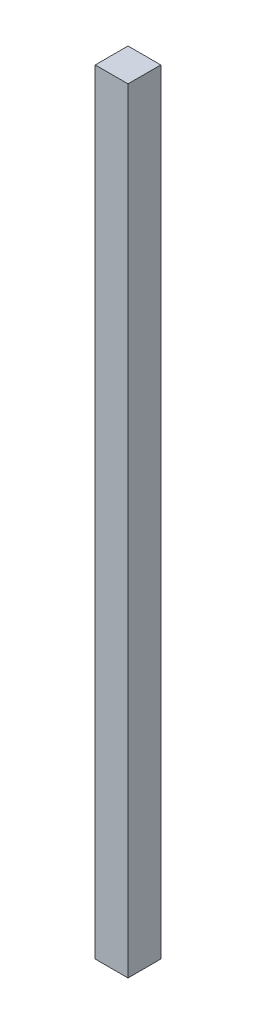
ISO-10303-21;
HEADER;
FILE_DESCRIPTION(('STEP AP214'),'2;1');
FILE_NAME('part.step','',(''),(''),'','','');
FILE_SCHEMA(('AUTOMOTIVE_DESIGN { 1 0 10303 214 1 1 1 1 }'));
ENDSEC;
DATA;
#1=APPLICATION_CONTEXT('core data for automotive mechanical design processes');
#2=APPLICATION_PROTOCOL_DEFINITION('international standard','automotive_design',2000,#1);
#3=PRODUCT_CONTEXT('',#1,'mechanical');
#4=PRODUCT('Part','Part','',(#3));
#5=PRODUCT_RELATED_PRODUCT_CATEGORY('part','',(#4));
#6=PRODUCT_DEFINITION_FORMATION('','',#4);
#7=PRODUCT_DEFINITION_CONTEXT('part definition',#1,'design');
#8=PRODUCT_DEFINITION('design','',#6,#7);
#9=PRODUCT_DEFINITION_SHAPE('','',#8);
#10=(LENGTH_UNIT() NAMED_UNIT(*) SI_UNIT(.MILLI.,.METRE.));
#11=(NAMED_UNIT(*) PLANE_ANGLE_UNIT() SI_UNIT($,.RADIAN.));
#12=(NAMED_UNIT(*) SI_UNIT($,.STERADIAN.) SOLID_ANGLE_UNIT());
#13=UNCERTAINTY_MEASURE_WITH_UNIT(LENGTH_MEASURE(1.E-05),#10,'distance_accuracy_value','');
#14=(GEOMETRIC_REPRESENTATION_CONTEXT(3) GLOBAL_UNCERTAINTY_ASSIGNED_CONTEXT((#13)) GLOBAL_UNIT_ASSIGNED_CONTEXT((#10,
#11,#12)) REPRESENTATION_CONTEXT('',''));
#15=CARTESIAN_POINT('',(0.,0.,0.));
#16=DIRECTION('',(0.,0.,1.));
#17=DIRECTION('',(1.,0.,0.));
#18=AXIS2_PLACEMENT_3D('',#15,#16,#17);
#19=CARTESIAN_POINT('',(0.,600.,0.));
#20=DIRECTION('',(1.,0.,0.));
#21=DIRECTION('',(0.,0.,-1.));
#22=AXIS2_PLACEMENT_3D('',#19,#20,#21);
#23=PLANE('',#22);
#24=DIRECTION('',(0.,0.,1.));
#25=VECTOR('',#24,1.);
#26=CARTESIAN_POINT('',(0.,0.,0.));
#27=LINE('',#26,#25);
#28=CARTESIAN_POINT('',(0.,0.,-25.4));
#29=VERTEX_POINT('',#28);
#30=CARTESIAN_POINT('',(0.,0.,0.));
#31=VERTEX_POINT('',#30);
#32=EDGE_CURVE('E108',#29,#31,#27,.T.);
#33=ORIENTED_EDGE('',*,*,#32,.T.);
#34=DIRECTION('',(0.,-1.,0.));
#35=VECTOR('',#34,1.);
#36=CARTESIAN_POINT('',(0.,600.,0.));
#37=LINE('',#36,#35);
#38=CARTESIAN_POINT('',(0.,600.,0.));
#39=VERTEX_POINT('',#38);
#40=EDGE_CURVE('E11',#39,#31,#37,.T.);
#41=ORIENTED_EDGE('',*,*,#40,.F.);
#42=DIRECTION('',(0.,0.,1.));
#43=VECTOR('',#42,1.);
#44=CARTESIAN_POINT('',(0.,600.,0.));
#45=LINE('',#44,#43);
#46=CARTESIAN_POINT('',(0.,600.,-25.4));
#47=VERTEX_POINT('',#46);
#48=EDGE_CURVE('E92',#47,#39,#45,.T.);
#49=ORIENTED_EDGE('',*,*,#48,.F.);
#50=DIRECTION('',(0.,-1.,0.));
#51=VECTOR('',#50,1.);
#52=CARTESIAN_POINT('',(0.,600.,-25.4));
#53=LINE('',#52,#51);
#54=EDGE_CURVE('E104',#47,#29,#53,.T.);
#55=ORIENTED_EDGE('',*,*,#54,.T.);
#56=EDGE_LOOP('',(#33,#41,#49,#55));
#57=FACE_BOUND('',#56,.T.);
#58=ADVANCED_FACE('F40',(#57),#23,.F.);
#59=CARTESIAN_POINT('',(0.,600.,0.));
#60=DIRECTION('',(0.,0.,-1.));
#61=DIRECTION('',(-1.,0.,0.));
#62=AXIS2_PLACEMENT_3D('',#59,#60,#61);
#63=PLANE('',#62);
#64=DIRECTION('',(1.,0.,0.));
#65=VECTOR('',#64,1.);
#66=CARTESIAN_POINT('',(0.,0.,0.));
#67=LINE('',#66,#65);
#68=CARTESIAN_POINT('',(25.4,0.,0.));
#69=VERTEX_POINT('',#68);
#70=EDGE_CURVE('E97',#31,#69,#67,.T.);
#71=ORIENTED_EDGE('',*,*,#70,.T.);
#72=DIRECTION('',(0.,-1.,0.));
#73=VECTOR('',#72,1.);
#74=CARTESIAN_POINT('',(25.4,600.,0.));
#75=LINE('',#74,#73);
#76=CARTESIAN_POINT('',(25.4,600.,0.));
#77=VERTEX_POINT('',#76);
#78=EDGE_CURVE('E49',#77,#69,#75,.T.);
#79=ORIENTED_EDGE('',*,*,#78,.F.);
#80=DIRECTION('',(1.,0.,0.));
#81=VECTOR('',#80,1.);
#82=CARTESIAN_POINT('',(0.,600.,0.));
#83=LINE('',#82,#81);
#84=EDGE_CURVE('E87',#39,#77,#83,.T.);
#85=ORIENTED_EDGE('',*,*,#84,.F.);
#86=ORIENTED_EDGE('',*,*,#40,.T.);
#87=EDGE_LOOP('',(#71,#79,#85,#86));
#88=FACE_BOUND('',#87,.T.);
#89=ADVANCED_FACE('F96',(#88),#63,.F.);
#90=CARTESIAN_POINT('',(25.4,600.,0.));
#91=DIRECTION('',(-1.,0.,0.));
#92=DIRECTION('',(0.,0.,1.));
#93=AXIS2_PLACEMENT_3D('',#90,#91,#92);
#94=PLANE('',#93);
#95=DIRECTION('',(0.,0.,-1.));
#96=VECTOR('',#95,1.);
#97=CARTESIAN_POINT('',(25.4,0.,0.));
#98=LINE('',#97,#96);
#99=CARTESIAN_POINT('',(25.4,0.,-25.4));
#100=VERTEX_POINT('',#99);
#101=EDGE_CURVE('E74',#69,#100,#98,.T.);
#102=ORIENTED_EDGE('',*,*,#101,.T.);
#103=DIRECTION('',(0.,-1.,0.));
#104=VECTOR('',#103,1.);
#105=CARTESIAN_POINT('',(25.4,600.,-25.4));
#106=LINE('',#105,#104);
#107=CARTESIAN_POINT('',(25.4,600.,-25.4));
#108=VERTEX_POINT('',#107);
#109=EDGE_CURVE('E99',#108,#100,#106,.T.);
#110=ORIENTED_EDGE('',*,*,#109,.F.);
#111=DIRECTION('',(0.,0.,-1.));
#112=VECTOR('',#111,1.);
#113=CARTESIAN_POINT('',(25.4,600.,0.));
#114=LINE('',#113,#112);
#115=EDGE_CURVE('E90',#77,#108,#114,.T.);
#116=ORIENTED_EDGE('',*,*,#115,.F.);
#117=ORIENTED_EDGE('',*,*,#78,.T.);
#118=EDGE_LOOP('',(#102,#110,#116,#117));
#119=FACE_BOUND('',#118,.T.);
#120=ADVANCED_FACE('F100',(#119),#94,.F.);
#121=CARTESIAN_POINT('',(0.,600.,-25.4));
#122=DIRECTION('',(0.,0.,1.));
#123=DIRECTION('',(1.,0.,0.));
#124=AXIS2_PLACEMENT_3D('',#121,#122,#123);
#125=PLANE('',#124);
#126=DIRECTION('',(-1.,0.,0.));
#127=VECTOR('',#126,1.);
#128=CARTESIAN_POINT('',(0.,0.,-25.4));
#129=LINE('',#128,#127);
#130=EDGE_CURVE('E80',#100,#29,#129,.T.);
#131=ORIENTED_EDGE('',*,*,#130,.T.);
#132=ORIENTED_EDGE('',*,*,#54,.F.);
#133=DIRECTION('',(-1.,0.,0.));
#134=VECTOR('',#133,1.);
#135=CARTESIAN_POINT('',(0.,600.,-25.4));
#136=LINE('',#135,#134);
#137=EDGE_CURVE('E57',#108,#47,#136,.T.);
#138=ORIENTED_EDGE('',*,*,#137,.F.);
#139=ORIENTED_EDGE('',*,*,#109,.T.);
#140=EDGE_LOOP('',(#131,#132,#138,#139));
#141=FACE_BOUND('',#140,.T.);
#142=ADVANCED_FACE('F121',(#141),#125,.F.);
#143=CARTESIAN_POINT('',(0.,600.,0.));
#144=DIRECTION('',(0.,-1.,0.));
#145=DIRECTION('',(0.,0.,-1.));
#146=AXIS2_PLACEMENT_3D('',#143,#144,#145);
#147=PLANE('',#146);
#148=ORIENTED_EDGE('',*,*,#48,.T.);
#149=ORIENTED_EDGE('',*,*,#84,.T.);
#150=ORIENTED_EDGE('',*,*,#115,.T.);
#151=ORIENTED_EDGE('',*,*,#137,.T.);
#152=EDGE_LOOP('',(#148,#149,#150,#151));
#153=FACE_BOUND('',#152,.T.);
#154=ADVANCED_FACE('F88',(#153),#147,.F.);
#155=CARTESIAN_POINT('',(0.,0.,0.));
#156=DIRECTION('',(0.,-1.,0.));
#157=DIRECTION('',(0.,0.,-1.));
#158=AXIS2_PLACEMENT_3D('',#155,#156,#157);
#159=PLANE('',#158);
#160=ORIENTED_EDGE('',*,*,#32,.F.);
#161=ORIENTED_EDGE('',*,*,#130,.F.);
#162=ORIENTED_EDGE('',*,*,#101,.F.);
#163=ORIENTED_EDGE('',*,*,#70,.F.);
#164=EDGE_LOOP('',(#160,#161,#162,#163));
#165=FACE_BOUND('',#164,.T.);
#166=ADVANCED_FACE('F124',(#165),#159,.T.);
#167=CLOSED_SHELL('',(#58,#89,#120,#142,#154,#166));
#168=MANIFOLD_SOLID_BREP('B2',#167);
#169=ADVANCED_BREP_SHAPE_REPRESENTATION('',(#18,#168),#14);
#170=SHAPE_DEFINITION_REPRESENTATION(#9,#169);
ENDSEC;
END-ISO-10303-21;
